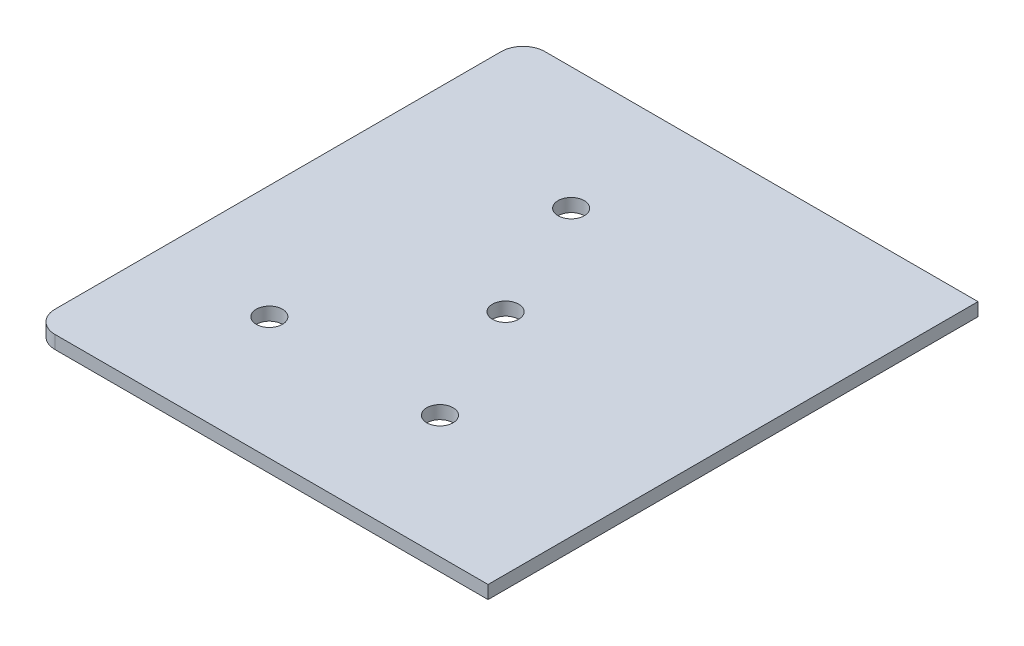
ISO-10303-21;
HEADER;
FILE_DESCRIPTION(('STEP AP214'),'2;1');
FILE_NAME('part.step','',(''),(''),'','','');
FILE_SCHEMA(('AUTOMOTIVE_DESIGN { 1 0 10303 214 1 1 1 1 }'));
ENDSEC;
DATA;
#1=APPLICATION_CONTEXT('core data for automotive mechanical design processes');
#2=APPLICATION_PROTOCOL_DEFINITION('international standard','automotive_design',2000,#1);
#3=PRODUCT_CONTEXT('',#1,'mechanical');
#4=PRODUCT('Part','Part','',(#3));
#5=PRODUCT_RELATED_PRODUCT_CATEGORY('part','',(#4));
#6=PRODUCT_DEFINITION_FORMATION('','',#4);
#7=PRODUCT_DEFINITION_CONTEXT('part definition',#1,'design');
#8=PRODUCT_DEFINITION('design','',#6,#7);
#9=PRODUCT_DEFINITION_SHAPE('','',#8);
#10=(LENGTH_UNIT() NAMED_UNIT(*) SI_UNIT(.MILLI.,.METRE.));
#11=(NAMED_UNIT(*) PLANE_ANGLE_UNIT() SI_UNIT($,.RADIAN.));
#12=(NAMED_UNIT(*) SI_UNIT($,.STERADIAN.) SOLID_ANGLE_UNIT());
#13=UNCERTAINTY_MEASURE_WITH_UNIT(LENGTH_MEASURE(1.E-05),#10,'distance_accuracy_value','');
#14=(GEOMETRIC_REPRESENTATION_CONTEXT(3) GLOBAL_UNCERTAINTY_ASSIGNED_CONTEXT((#13)) GLOBAL_UNIT_ASSIGNED_CONTEXT((#10,
#11,#12)) REPRESENTATION_CONTEXT('',''));
#15=CARTESIAN_POINT('',(0.,0.,0.));
#16=DIRECTION('',(0.,0.,1.));
#17=DIRECTION('',(1.,0.,0.));
#18=AXIS2_PLACEMENT_3D('',#15,#16,#17);
#19=CARTESIAN_POINT('',(228.6,9.525,0.));
#20=DIRECTION('',(1.,0.,0.));
#21=DIRECTION('',(0.,0.,-1.));
#22=AXIS2_PLACEMENT_3D('',#19,#20,#21);
#23=PLANE('',#22);
#24=DIRECTION('',(0.,0.,1.));
#25=VECTOR('',#24,1.);
#26=CARTESIAN_POINT('',(228.6,0.,0.));
#27=LINE('',#26,#25);
#28=CARTESIAN_POINT('',(228.6,0.,-161.925));
#29=VERTEX_POINT('',#28);
#30=CARTESIAN_POINT('',(228.6,0.,161.925));
#31=VERTEX_POINT('',#30);
#32=EDGE_CURVE('E115',#29,#31,#27,.T.);
#33=ORIENTED_EDGE('',*,*,#32,.T.);
#34=DIRECTION('',(0.,-1.,0.));
#35=VECTOR('',#34,1.);
#36=CARTESIAN_POINT('',(228.6,9.525,161.925));
#37=LINE('',#36,#35);
#38=CARTESIAN_POINT('',(228.6,9.525,161.925));
#39=VERTEX_POINT('',#38);
#40=EDGE_CURVE('E57',#31,#39,#37,.F.);
#41=ORIENTED_EDGE('',*,*,#40,.T.);
#42=DIRECTION('',(0.,0.,1.));
#43=VECTOR('',#42,1.);
#44=CARTESIAN_POINT('',(228.6,9.525,0.));
#45=LINE('',#44,#43);
#46=CARTESIAN_POINT('',(228.6,9.525,-161.925));
#47=VERTEX_POINT('',#46);
#48=EDGE_CURVE('E110',#47,#39,#45,.T.);
#49=ORIENTED_EDGE('',*,*,#48,.F.);
#50=DIRECTION('',(0.,-1.,0.));
#51=VECTOR('',#50,1.);
#52=CARTESIAN_POINT('',(228.6,0.,-161.925));
#53=LINE('',#52,#51);
#54=EDGE_CURVE('E133',#47,#29,#53,.T.);
#55=ORIENTED_EDGE('',*,*,#54,.T.);
#56=EDGE_LOOP('',(#33,#41,#49,#55));
#57=FACE_BOUND('',#56,.T.);
#58=ADVANCED_FACE('F36',(#57),#23,.F.);
#59=CARTESIAN_POINT('',(558.8,9.525,0.));
#60=DIRECTION('',(-1.,0.,0.));
#61=DIRECTION('',(0.,0.,1.));
#62=AXIS2_PLACEMENT_3D('',#59,#60,#61);
#63=PLANE('',#62);
#64=DIRECTION('',(0.,0.,-1.));
#65=VECTOR('',#64,1.);
#66=CARTESIAN_POINT('',(558.8,0.,0.));
#67=LINE('',#66,#65);
#68=CARTESIAN_POINT('',(558.8,0.,177.8));
#69=VERTEX_POINT('',#68);
#70=CARTESIAN_POINT('',(558.8,0.,-177.8));
#71=VERTEX_POINT('',#70);
#72=EDGE_CURVE('E117',#69,#71,#67,.T.);
#73=ORIENTED_EDGE('',*,*,#72,.T.);
#74=DIRECTION('',(0.,-1.,0.));
#75=VECTOR('',#74,1.);
#76=CARTESIAN_POINT('',(558.8,9.525,-177.8));
#77=LINE('',#76,#75);
#78=CARTESIAN_POINT('',(558.8,9.525,-177.8));
#79=VERTEX_POINT('',#78);
#80=EDGE_CURVE('E108',#79,#71,#77,.T.);
#81=ORIENTED_EDGE('',*,*,#80,.F.);
#82=DIRECTION('',(0.,0.,-1.));
#83=VECTOR('',#82,1.);
#84=CARTESIAN_POINT('',(558.8,9.525,0.));
#85=LINE('',#84,#83);
#86=CARTESIAN_POINT('',(558.8,9.525,177.8));
#87=VERTEX_POINT('',#86);
#88=EDGE_CURVE('E93',#87,#79,#85,.T.);
#89=ORIENTED_EDGE('',*,*,#88,.F.);
#90=DIRECTION('',(0.,-1.,0.));
#91=VECTOR('',#90,1.);
#92=CARTESIAN_POINT('',(558.8,9.525,177.8));
#93=LINE('',#92,#91);
#94=EDGE_CURVE('E100',#87,#69,#93,.T.);
#95=ORIENTED_EDGE('',*,*,#94,.T.);
#96=EDGE_LOOP('',(#73,#81,#89,#95));
#97=FACE_BOUND('',#96,.T.);
#98=ADVANCED_FACE('F106',(#97),#63,.F.);
#99=CARTESIAN_POINT('',(-912.372794199772,9.525,-177.8));
#100=DIRECTION('',(0.,0.,-1.));
#101=DIRECTION('',(-1.,0.,0.));
#102=AXIS2_PLACEMENT_3D('',#99,#100,#101);
#103=PLANE('',#102);
#104=DIRECTION('',(1.,0.,0.));
#105=VECTOR('',#104,1.);
#106=CARTESIAN_POINT('',(-912.372794199772,0.,-177.8));
#107=LINE('',#106,#105);
#108=CARTESIAN_POINT('',(244.475,0.,-177.8));
#109=VERTEX_POINT('',#108);
#110=EDGE_CURVE('E121',#109,#71,#107,.T.);
#111=ORIENTED_EDGE('',*,*,#110,.F.);
#112=DIRECTION('',(0.,-1.,0.));
#113=VECTOR('',#112,1.);
#114=CARTESIAN_POINT('',(244.475,9.525,-177.8));
#115=LINE('',#114,#113);
#116=CARTESIAN_POINT('',(244.475,9.525,-177.8));
#117=VERTEX_POINT('',#116);
#118=EDGE_CURVE('E11',#109,#117,#115,.F.);
#119=ORIENTED_EDGE('',*,*,#118,.T.);
#120=DIRECTION('',(1.,0.,0.));
#121=VECTOR('',#120,1.);
#122=CARTESIAN_POINT('',(-912.372794199772,9.525,-177.8));
#123=LINE('',#122,#121);
#124=EDGE_CURVE('E109',#117,#79,#123,.T.);
#125=ORIENTED_EDGE('',*,*,#124,.T.);
#126=ORIENTED_EDGE('',*,*,#80,.T.);
#127=EDGE_LOOP('',(#111,#119,#125,#126));
#128=FACE_BOUND('',#127,.T.);
#129=ADVANCED_FACE('F144',(#128),#103,.T.);
#130=CARTESIAN_POINT('',(-912.372794199772,9.525,0.));
#131=DIRECTION('',(0.,1.,0.));
#132=DIRECTION('',(0.,0.,1.));
#133=AXIS2_PLACEMENT_3D('',#130,#131,#132);
#134=PLANE('',#133);
#135=CARTESIAN_POINT('',(393.7,9.525,0.));
#136=DIRECTION('',(0.,-1.,0.));
#137=DIRECTION('',(0.,0.,-1.));
#138=AXIS2_PLACEMENT_3D('',#135,#136,#137);
#139=CIRCLE('',#138,9.52500000000002);
#140=CARTESIAN_POINT('',(393.7,9.525,-9.52499999999999));
#141=VERTEX_POINT('',#140);
#142=EDGE_CURVE('E164',#141,#141,#139,.T.);
#143=ORIENTED_EDGE('',*,*,#142,.T.);
#144=EDGE_LOOP('',(#143));
#145=FACE_BOUND('',#144,.T.);
#146=CARTESIAN_POINT('',(352.425,9.525,-88.9));
#147=DIRECTION('',(0.,-1.,0.));
#148=DIRECTION('',(0.,0.,-1.));
#149=AXIS2_PLACEMENT_3D('',#146,#147,#148);
#150=CIRCLE('',#149,9.52500000000002);
#151=CARTESIAN_POINT('',(352.425,9.525,-98.425));
#152=VERTEX_POINT('',#151);
#153=EDGE_CURVE('E158',#152,#152,#150,.T.);
#154=ORIENTED_EDGE('',*,*,#153,.T.);
#155=EDGE_LOOP('',(#154));
#156=FACE_BOUND('',#155,.T.);
#157=CARTESIAN_POINT('',(311.15,9.525,88.9));
#158=DIRECTION('',(0.,-1.,0.));
#159=DIRECTION('',(0.,0.,-1.));
#160=AXIS2_PLACEMENT_3D('',#157,#158,#159);
#161=CIRCLE('',#160,9.52500000000002);
#162=CARTESIAN_POINT('',(311.15,9.525,79.375));
#163=VERTEX_POINT('',#162);
#164=EDGE_CURVE('E152',#163,#163,#161,.T.);
#165=ORIENTED_EDGE('',*,*,#164,.T.);
#166=EDGE_LOOP('',(#165));
#167=FACE_BOUND('',#166,.T.);
#168=CARTESIAN_POINT('',(434.975,9.525,88.9000000000001));
#169=DIRECTION('',(0.,-1.,0.));
#170=DIRECTION('',(0.,0.,-1.));
#171=AXIS2_PLACEMENT_3D('',#168,#169,#170);
#172=CIRCLE('',#171,9.52500000000002);
#173=CARTESIAN_POINT('',(434.975,9.525,79.375));
#174=VERTEX_POINT('',#173);
#175=EDGE_CURVE('E145',#174,#174,#172,.T.);
#176=ORIENTED_EDGE('',*,*,#175,.T.);
#177=EDGE_LOOP('',(#176));
#178=FACE_BOUND('',#177,.T.);
#179=ORIENTED_EDGE('',*,*,#48,.T.);
#180=CARTESIAN_POINT('',(244.475,9.525,161.925));
#181=DIRECTION('',(0.,1.,0.));
#182=DIRECTION('',(0.,0.,1.));
#183=AXIS2_PLACEMENT_3D('',#180,#181,#182);
#184=CIRCLE('',#183,15.875);
#185=CARTESIAN_POINT('',(244.475,9.525,177.8));
#186=VERTEX_POINT('',#185);
#187=EDGE_CURVE('E44',#39,#186,#184,.T.);
#188=ORIENTED_EDGE('',*,*,#187,.T.);
#189=DIRECTION('',(1.,0.,0.));
#190=VECTOR('',#189,1.);
#191=CARTESIAN_POINT('',(-912.372794199772,9.525,177.8));
#192=LINE('',#191,#190);
#193=EDGE_CURVE('E90',#186,#87,#192,.T.);
#194=ORIENTED_EDGE('',*,*,#193,.T.);
#195=ORIENTED_EDGE('',*,*,#88,.T.);
#196=ORIENTED_EDGE('',*,*,#124,.F.);
#197=CARTESIAN_POINT('',(244.475,9.525,-161.925));
#198=DIRECTION('',(0.,1.,0.));
#199=DIRECTION('',(0.,0.,1.));
#200=AXIS2_PLACEMENT_3D('',#197,#198,#199);
#201=CIRCLE('',#200,15.875);
#202=EDGE_CURVE('E137',#117,#47,#201,.T.);
#203=ORIENTED_EDGE('',*,*,#202,.T.);
#204=EDGE_LOOP('',(#179,#188,#194,#195,#196,#203));
#205=FACE_BOUND('',#204,.T.);
#206=ADVANCED_FACE('F92',(#145,#156,#167,#178,#205),#134,.T.);
#207=CARTESIAN_POINT('',(-912.372794199772,0.,0.));
#208=DIRECTION('',(0.,1.,0.));
#209=DIRECTION('',(0.,0.,1.));
#210=AXIS2_PLACEMENT_3D('',#207,#208,#209);
#211=PLANE('',#210);
#212=CARTESIAN_POINT('',(393.7,0.,0.));
#213=DIRECTION('',(0.,-1.,0.));
#214=DIRECTION('',(0.,0.,-1.));
#215=AXIS2_PLACEMENT_3D('',#212,#213,#214);
#216=CIRCLE('',#215,9.52500000000002);
#217=CARTESIAN_POINT('',(393.7,0.,-9.52499999999999));
#218=VERTEX_POINT('',#217);
#219=EDGE_CURVE('E167',#218,#218,#216,.T.);
#220=ORIENTED_EDGE('',*,*,#219,.F.);
#221=EDGE_LOOP('',(#220));
#222=FACE_BOUND('',#221,.T.);
#223=CARTESIAN_POINT('',(352.425,0.,-88.9));
#224=DIRECTION('',(0.,-1.,0.));
#225=DIRECTION('',(0.,0.,-1.));
#226=AXIS2_PLACEMENT_3D('',#223,#224,#225);
#227=CIRCLE('',#226,9.52500000000002);
#228=CARTESIAN_POINT('',(352.425,0.,-98.425));
#229=VERTEX_POINT('',#228);
#230=EDGE_CURVE('E161',#229,#229,#227,.T.);
#231=ORIENTED_EDGE('',*,*,#230,.F.);
#232=EDGE_LOOP('',(#231));
#233=FACE_BOUND('',#232,.T.);
#234=CARTESIAN_POINT('',(311.15,0.,88.9));
#235=DIRECTION('',(0.,-1.,0.));
#236=DIRECTION('',(0.,0.,-1.));
#237=AXIS2_PLACEMENT_3D('',#234,#235,#236);
#238=CIRCLE('',#237,9.52500000000002);
#239=CARTESIAN_POINT('',(311.15,0.,79.375));
#240=VERTEX_POINT('',#239);
#241=EDGE_CURVE('E155',#240,#240,#238,.T.);
#242=ORIENTED_EDGE('',*,*,#241,.F.);
#243=EDGE_LOOP('',(#242));
#244=FACE_BOUND('',#243,.T.);
#245=CARTESIAN_POINT('',(434.975,0.,88.9000000000001));
#246=DIRECTION('',(0.,-1.,0.));
#247=DIRECTION('',(0.,0.,-1.));
#248=AXIS2_PLACEMENT_3D('',#245,#246,#247);
#249=CIRCLE('',#248,9.52500000000002);
#250=CARTESIAN_POINT('',(434.975,0.,79.375));
#251=VERTEX_POINT('',#250);
#252=EDGE_CURVE('E147',#251,#251,#249,.T.);
#253=ORIENTED_EDGE('',*,*,#252,.F.);
#254=EDGE_LOOP('',(#253));
#255=FACE_BOUND('',#254,.T.);
#256=DIRECTION('',(1.,0.,0.));
#257=VECTOR('',#256,1.);
#258=CARTESIAN_POINT('',(-912.372794199772,0.,177.8));
#259=LINE('',#258,#257);
#260=CARTESIAN_POINT('',(244.475,0.,177.8));
#261=VERTEX_POINT('',#260);
#262=EDGE_CURVE('E101',#261,#69,#259,.T.);
#263=ORIENTED_EDGE('',*,*,#262,.F.);
#264=CARTESIAN_POINT('',(244.475,0.,161.925));
#265=DIRECTION('',(0.,1.,0.));
#266=DIRECTION('',(0.,0.,1.));
#267=AXIS2_PLACEMENT_3D('',#264,#265,#266);
#268=CIRCLE('',#267,15.875);
#269=EDGE_CURVE('E131',#261,#31,#268,.F.);
#270=ORIENTED_EDGE('',*,*,#269,.T.);
#271=ORIENTED_EDGE('',*,*,#32,.F.);
#272=CARTESIAN_POINT('',(244.475,0.,-161.925));
#273=DIRECTION('',(0.,1.,0.));
#274=DIRECTION('',(0.,0.,1.));
#275=AXIS2_PLACEMENT_3D('',#272,#273,#274);
#276=CIRCLE('',#275,15.875);
#277=EDGE_CURVE('E129',#29,#109,#276,.F.);
#278=ORIENTED_EDGE('',*,*,#277,.T.);
#279=ORIENTED_EDGE('',*,*,#110,.T.);
#280=ORIENTED_EDGE('',*,*,#72,.F.);
#281=EDGE_LOOP('',(#263,#270,#271,#278,#279,#280));
#282=FACE_BOUND('',#281,.T.);
#283=ADVANCED_FACE('F143',(#222,#233,#244,#255,#282),#211,.F.);
#284=CARTESIAN_POINT('',(-912.372794199772,9.525,177.8));
#285=DIRECTION('',(0.,0.,-1.));
#286=DIRECTION('',(-1.,0.,0.));
#287=AXIS2_PLACEMENT_3D('',#284,#285,#286);
#288=PLANE('',#287);
#289=ORIENTED_EDGE('',*,*,#193,.F.);
#290=DIRECTION('',(0.,-1.,0.));
#291=VECTOR('',#290,1.);
#292=CARTESIAN_POINT('',(244.475,9.525,177.8));
#293=LINE('',#292,#291);
#294=EDGE_CURVE('E127',#186,#261,#293,.T.);
#295=ORIENTED_EDGE('',*,*,#294,.T.);
#296=ORIENTED_EDGE('',*,*,#262,.T.);
#297=ORIENTED_EDGE('',*,*,#94,.F.);
#298=EDGE_LOOP('',(#289,#295,#296,#297));
#299=FACE_BOUND('',#298,.T.);
#300=ADVANCED_FACE('F112',(#299),#288,.F.);
#301=CARTESIAN_POINT('',(434.975,9.525,88.9000000000001));
#302=DIRECTION('',(0.,-1.,0.));
#303=DIRECTION('',(0.,0.,-1.));
#304=AXIS2_PLACEMENT_3D('',#301,#302,#303);
#305=CYLINDRICAL_SURFACE('',#304,9.52500000000002);
#306=CARTESIAN_POINT('',(434.975,9.525,79.375));
#307=CARTESIAN_POINT('',(434.975,9.42578125,79.375));
#308=CARTESIAN_POINT('',(434.975,9.3265625,79.375));
#309=CARTESIAN_POINT('',(434.975,9.128125,79.375));
#310=CARTESIAN_POINT('',(434.975,9.02890625,79.375));
#311=CARTESIAN_POINT('',(434.975,8.83046875,79.375));
#312=CARTESIAN_POINT('',(434.975,8.73125,79.375));
#313=CARTESIAN_POINT('',(434.975,8.5328125,79.375));
#314=CARTESIAN_POINT('',(434.975,8.43359375,79.375));
#315=CARTESIAN_POINT('',(434.975,8.23515625,79.375));
#316=CARTESIAN_POINT('',(434.975,8.1359375,79.375));
#317=CARTESIAN_POINT('',(434.975,7.9375,79.375));
#318=CARTESIAN_POINT('',(434.975,7.83828125,79.375));
#319=CARTESIAN_POINT('',(434.975,7.63984375,79.375));
#320=CARTESIAN_POINT('',(434.975,7.540625,79.375));
#321=CARTESIAN_POINT('',(434.975,7.3421875,79.375));
#322=CARTESIAN_POINT('',(434.975,7.24296875,79.375));
#323=CARTESIAN_POINT('',(434.975,7.04453125,79.375));
#324=CARTESIAN_POINT('',(434.975,6.9453125,79.375));
#325=CARTESIAN_POINT('',(434.975,6.746875,79.375));
#326=CARTESIAN_POINT('',(434.975,6.64765625,79.375));
#327=CARTESIAN_POINT('',(434.975,6.44921875,79.375));
#328=CARTESIAN_POINT('',(434.975,6.35,79.375));
#329=CARTESIAN_POINT('',(434.975,6.1515625,79.375));
#330=CARTESIAN_POINT('',(434.975,6.05234375,79.375));
#331=CARTESIAN_POINT('',(434.975,5.85390625,79.375));
#332=CARTESIAN_POINT('',(434.975,5.7546875,79.375));
#333=CARTESIAN_POINT('',(434.975,5.55625,79.375));
#334=CARTESIAN_POINT('',(434.975,5.45703125,79.375));
#335=CARTESIAN_POINT('',(434.975,5.25859375,79.375));
#336=CARTESIAN_POINT('',(434.975,5.159375,79.375));
#337=CARTESIAN_POINT('',(434.975,4.9609375,79.375));
#338=CARTESIAN_POINT('',(434.975,4.86171875,79.375));
#339=CARTESIAN_POINT('',(434.975,4.66328125,79.375));
#340=CARTESIAN_POINT('',(434.975,4.5640625,79.375));
#341=CARTESIAN_POINT('',(434.975,4.365625,79.375));
#342=CARTESIAN_POINT('',(434.975,4.26640625,79.375));
#343=CARTESIAN_POINT('',(434.975,4.06796875,79.375));
#344=CARTESIAN_POINT('',(434.975,3.96875,79.375));
#345=CARTESIAN_POINT('',(434.975,3.7703125,79.375));
#346=CARTESIAN_POINT('',(434.975,3.67109375,79.375));
#347=CARTESIAN_POINT('',(434.975,3.47265625,79.375));
#348=CARTESIAN_POINT('',(434.975,3.3734375,79.375));
#349=CARTESIAN_POINT('',(434.975,3.175,79.375));
#350=CARTESIAN_POINT('',(434.975,3.07578125,79.375));
#351=CARTESIAN_POINT('',(434.975,2.87734375,79.375));
#352=CARTESIAN_POINT('',(434.975,2.778125,79.375));
#353=CARTESIAN_POINT('',(434.975,2.5796875,79.375));
#354=CARTESIAN_POINT('',(434.975,2.48046875,79.375));
#355=CARTESIAN_POINT('',(434.975,2.28203125,79.375));
#356=CARTESIAN_POINT('',(434.975,2.1828125,79.375));
#357=CARTESIAN_POINT('',(434.975,1.984375,79.375));
#358=CARTESIAN_POINT('',(434.975,1.88515625,79.375));
#359=CARTESIAN_POINT('',(434.975,1.68671875,79.375));
#360=CARTESIAN_POINT('',(434.975,1.5875,79.375));
#361=CARTESIAN_POINT('',(434.975,1.3890625,79.375));
#362=CARTESIAN_POINT('',(434.975,1.28984375,79.375));
#363=CARTESIAN_POINT('',(434.975,1.09140625,79.375));
#364=CARTESIAN_POINT('',(434.975,0.992187500000001,79.375));
#365=CARTESIAN_POINT('',(434.975,0.793750000000001,79.375));
#366=CARTESIAN_POINT('',(434.975,0.69453125,79.375));
#367=CARTESIAN_POINT('',(434.975,0.49609375,79.375));
#368=CARTESIAN_POINT('',(434.975,0.396875,79.375));
#369=CARTESIAN_POINT('',(434.975,0.1984375,79.375));
#370=CARTESIAN_POINT('',(434.975,0.0992187500000001,79.375));
#371=CARTESIAN_POINT('',(434.975,0.,79.375));
#372=B_SPLINE_CURVE_WITH_KNOTS('',3,(#306,#307,#308,#309,#310,#311,#312,#313,#314,#315,#316,
#317,#318,#319,#320,#321,#322,#323,#324,#325,#326,#327,#328,#329,#330,#331,#332,#333,#334,#335,
#336,#337,#338,#339,#340,#341,#342,#343,#344,#345,#346,#347,#348,#349,#350,#351,#352,#353,#354,
#355,#356,#357,#358,#359,#360,#361,#362,#363,#364,#365,#366,#367,#368,#369,#370,#371),
.UNSPECIFIED.,.F.,.F.,(4,2,2,2,2,2,2,2,2,2,2,2,2,2,2,2,2,2,2,2,2,2,2,2,2,2,2,2,2,2,2,2,4),(0.,
0.29765625,0.5953125,0.892968750000001,1.190625,1.48828125,1.7859375,2.08359375,2.38125,
2.67890625,2.9765625,3.27421875,3.571875,3.86953125,4.1671875,4.46484375,4.7625,5.06015625,
5.3578125,5.65546875,5.953125,6.25078125,6.5484375,6.84609375,7.14375,7.44140625,7.7390625,
8.03671875,8.334375,8.63203125,8.9296875,9.22734375,9.525),.UNSPECIFIED.);
#373=EDGE_CURVE('BSEAM192',#174,#251,#372,.T.);
#374=ORIENTED_EDGE('',*,*,#175,.F.);
#375=ORIENTED_EDGE('',*,*,#252,.T.);
#376=ORIENTED_EDGE('',*,*,#373,.T.);
#377=ORIENTED_EDGE('',*,*,#373,.F.);
#378=EDGE_LOOP('',(#374,#376,#375,#377));
#379=FACE_BOUND('',#378,.T.);
#380=ADVANCED_FACE('F192',(#379),#305,.F.);
#381=CARTESIAN_POINT('',(311.15,9.525,88.9));
#382=DIRECTION('',(0.,-1.,0.));
#383=DIRECTION('',(0.,0.,-1.));
#384=AXIS2_PLACEMENT_3D('',#381,#382,#383);
#385=CYLINDRICAL_SURFACE('',#384,9.52500000000002);
#386=CARTESIAN_POINT('',(311.15,9.525,79.375));
#387=CARTESIAN_POINT('',(311.15,9.42578125,79.375));
#388=CARTESIAN_POINT('',(311.15,9.3265625,79.375));
#389=CARTESIAN_POINT('',(311.15,9.128125,79.375));
#390=CARTESIAN_POINT('',(311.15,9.02890625,79.375));
#391=CARTESIAN_POINT('',(311.15,8.83046875,79.375));
#392=CARTESIAN_POINT('',(311.15,8.73125,79.375));
#393=CARTESIAN_POINT('',(311.15,8.5328125,79.375));
#394=CARTESIAN_POINT('',(311.15,8.43359375,79.375));
#395=CARTESIAN_POINT('',(311.15,8.23515625,79.375));
#396=CARTESIAN_POINT('',(311.15,8.1359375,79.375));
#397=CARTESIAN_POINT('',(311.15,7.9375,79.375));
#398=CARTESIAN_POINT('',(311.15,7.83828125,79.375));
#399=CARTESIAN_POINT('',(311.15,7.63984375,79.375));
#400=CARTESIAN_POINT('',(311.15,7.540625,79.375));
#401=CARTESIAN_POINT('',(311.15,7.3421875,79.375));
#402=CARTESIAN_POINT('',(311.15,7.24296875,79.375));
#403=CARTESIAN_POINT('',(311.15,7.04453125,79.375));
#404=CARTESIAN_POINT('',(311.15,6.9453125,79.375));
#405=CARTESIAN_POINT('',(311.15,6.746875,79.375));
#406=CARTESIAN_POINT('',(311.15,6.64765625,79.375));
#407=CARTESIAN_POINT('',(311.15,6.44921875,79.375));
#408=CARTESIAN_POINT('',(311.15,6.35,79.375));
#409=CARTESIAN_POINT('',(311.15,6.1515625,79.375));
#410=CARTESIAN_POINT('',(311.15,6.05234375,79.375));
#411=CARTESIAN_POINT('',(311.15,5.85390625,79.375));
#412=CARTESIAN_POINT('',(311.15,5.7546875,79.375));
#413=CARTESIAN_POINT('',(311.15,5.55625,79.375));
#414=CARTESIAN_POINT('',(311.15,5.45703125,79.375));
#415=CARTESIAN_POINT('',(311.15,5.25859375,79.375));
#416=CARTESIAN_POINT('',(311.15,5.159375,79.375));
#417=CARTESIAN_POINT('',(311.15,4.9609375,79.375));
#418=CARTESIAN_POINT('',(311.15,4.86171875,79.375));
#419=CARTESIAN_POINT('',(311.15,4.66328125,79.375));
#420=CARTESIAN_POINT('',(311.15,4.5640625,79.375));
#421=CARTESIAN_POINT('',(311.15,4.365625,79.375));
#422=CARTESIAN_POINT('',(311.15,4.26640625,79.375));
#423=CARTESIAN_POINT('',(311.15,4.06796875,79.375));
#424=CARTESIAN_POINT('',(311.15,3.96875,79.375));
#425=CARTESIAN_POINT('',(311.15,3.7703125,79.375));
#426=CARTESIAN_POINT('',(311.15,3.67109375,79.375));
#427=CARTESIAN_POINT('',(311.15,3.47265625,79.375));
#428=CARTESIAN_POINT('',(311.15,3.3734375,79.375));
#429=CARTESIAN_POINT('',(311.15,3.175,79.375));
#430=CARTESIAN_POINT('',(311.15,3.07578125,79.375));
#431=CARTESIAN_POINT('',(311.15,2.87734375,79.375));
#432=CARTESIAN_POINT('',(311.15,2.778125,79.375));
#433=CARTESIAN_POINT('',(311.15,2.5796875,79.375));
#434=CARTESIAN_POINT('',(311.15,2.48046875,79.375));
#435=CARTESIAN_POINT('',(311.15,2.28203125,79.375));
#436=CARTESIAN_POINT('',(311.15,2.1828125,79.375));
#437=CARTESIAN_POINT('',(311.15,1.984375,79.375));
#438=CARTESIAN_POINT('',(311.15,1.88515625,79.375));
#439=CARTESIAN_POINT('',(311.15,1.68671875,79.375));
#440=CARTESIAN_POINT('',(311.15,1.5875,79.375));
#441=CARTESIAN_POINT('',(311.15,1.3890625,79.375));
#442=CARTESIAN_POINT('',(311.15,1.28984375,79.375));
#443=CARTESIAN_POINT('',(311.15,1.09140625,79.375));
#444=CARTESIAN_POINT('',(311.15,0.992187500000001,79.375));
#445=CARTESIAN_POINT('',(311.15,0.793750000000001,79.375));
#446=CARTESIAN_POINT('',(311.15,0.69453125,79.375));
#447=CARTESIAN_POINT('',(311.15,0.49609375,79.375));
#448=CARTESIAN_POINT('',(311.15,0.396875,79.375));
#449=CARTESIAN_POINT('',(311.15,0.1984375,79.375));
#450=CARTESIAN_POINT('',(311.15,0.0992187500000001,79.375));
#451=CARTESIAN_POINT('',(311.15,0.,79.375));
#452=B_SPLINE_CURVE_WITH_KNOTS('',3,(#386,#387,#388,#389,#390,#391,#392,#393,#394,#395,#396,
#397,#398,#399,#400,#401,#402,#403,#404,#405,#406,#407,#408,#409,#410,#411,#412,#413,#414,#415,
#416,#417,#418,#419,#420,#421,#422,#423,#424,#425,#426,#427,#428,#429,#430,#431,#432,#433,#434,
#435,#436,#437,#438,#439,#440,#441,#442,#443,#444,#445,#446,#447,#448,#449,#450,#451),
.UNSPECIFIED.,.F.,.F.,(4,2,2,2,2,2,2,2,2,2,2,2,2,2,2,2,2,2,2,2,2,2,2,2,2,2,2,2,2,2,2,2,4),(0.,
0.29765625,0.5953125,0.892968750000001,1.190625,1.48828125,1.7859375,2.08359375,2.38125,
2.67890625,2.9765625,3.27421875,3.571875,3.86953125,4.1671875,4.46484375,4.7625,5.06015625,
5.3578125,5.65546875,5.953125,6.25078125,6.5484375,6.84609375,7.14375,7.44140625,7.7390625,
8.03671875,8.334375,8.63203125,8.9296875,9.22734375,9.525),.UNSPECIFIED.);
#453=EDGE_CURVE('BSEAM194',#163,#240,#452,.T.);
#454=ORIENTED_EDGE('',*,*,#164,.F.);
#455=ORIENTED_EDGE('',*,*,#241,.T.);
#456=ORIENTED_EDGE('',*,*,#453,.T.);
#457=ORIENTED_EDGE('',*,*,#453,.F.);
#458=EDGE_LOOP('',(#454,#456,#455,#457));
#459=FACE_BOUND('',#458,.T.);
#460=ADVANCED_FACE('F194',(#459),#385,.F.);
#461=CARTESIAN_POINT('',(352.425,9.525,-88.9));
#462=DIRECTION('',(0.,-1.,0.));
#463=DIRECTION('',(0.,0.,-1.));
#464=AXIS2_PLACEMENT_3D('',#461,#462,#463);
#465=CYLINDRICAL_SURFACE('',#464,9.52500000000002);
#466=CARTESIAN_POINT('',(352.425,9.525,-98.425));
#467=CARTESIAN_POINT('',(352.425,9.42578125,-98.425));
#468=CARTESIAN_POINT('',(352.425,9.3265625,-98.425));
#469=CARTESIAN_POINT('',(352.425,9.128125,-98.425));
#470=CARTESIAN_POINT('',(352.425,9.02890625,-98.425));
#471=CARTESIAN_POINT('',(352.425,8.83046875,-98.425));
#472=CARTESIAN_POINT('',(352.425,8.73125,-98.425));
#473=CARTESIAN_POINT('',(352.425,8.5328125,-98.425));
#474=CARTESIAN_POINT('',(352.425,8.43359375,-98.425));
#475=CARTESIAN_POINT('',(352.425,8.23515625,-98.425));
#476=CARTESIAN_POINT('',(352.425,8.1359375,-98.425));
#477=CARTESIAN_POINT('',(352.425,7.9375,-98.425));
#478=CARTESIAN_POINT('',(352.425,7.83828125,-98.425));
#479=CARTESIAN_POINT('',(352.425,7.63984375,-98.425));
#480=CARTESIAN_POINT('',(352.425,7.540625,-98.425));
#481=CARTESIAN_POINT('',(352.425,7.3421875,-98.425));
#482=CARTESIAN_POINT('',(352.425,7.24296875,-98.425));
#483=CARTESIAN_POINT('',(352.425,7.04453125,-98.425));
#484=CARTESIAN_POINT('',(352.425,6.9453125,-98.425));
#485=CARTESIAN_POINT('',(352.425,6.746875,-98.425));
#486=CARTESIAN_POINT('',(352.425,6.64765625,-98.425));
#487=CARTESIAN_POINT('',(352.425,6.44921875,-98.425));
#488=CARTESIAN_POINT('',(352.425,6.35,-98.425));
#489=CARTESIAN_POINT('',(352.425,6.1515625,-98.425));
#490=CARTESIAN_POINT('',(352.425,6.05234375,-98.425));
#491=CARTESIAN_POINT('',(352.425,5.85390625,-98.425));
#492=CARTESIAN_POINT('',(352.425,5.7546875,-98.425));
#493=CARTESIAN_POINT('',(352.425,5.55625,-98.425));
#494=CARTESIAN_POINT('',(352.425,5.45703125,-98.425));
#495=CARTESIAN_POINT('',(352.425,5.25859375,-98.425));
#496=CARTESIAN_POINT('',(352.425,5.159375,-98.425));
#497=CARTESIAN_POINT('',(352.425,4.9609375,-98.425));
#498=CARTESIAN_POINT('',(352.425,4.86171875,-98.425));
#499=CARTESIAN_POINT('',(352.425,4.66328125,-98.425));
#500=CARTESIAN_POINT('',(352.425,4.5640625,-98.425));
#501=CARTESIAN_POINT('',(352.425,4.365625,-98.425));
#502=CARTESIAN_POINT('',(352.425,4.26640625,-98.425));
#503=CARTESIAN_POINT('',(352.425,4.06796875,-98.425));
#504=CARTESIAN_POINT('',(352.425,3.96875,-98.425));
#505=CARTESIAN_POINT('',(352.425,3.7703125,-98.425));
#506=CARTESIAN_POINT('',(352.425,3.67109375,-98.425));
#507=CARTESIAN_POINT('',(352.425,3.47265625,-98.425));
#508=CARTESIAN_POINT('',(352.425,3.3734375,-98.425));
#509=CARTESIAN_POINT('',(352.425,3.175,-98.425));
#510=CARTESIAN_POINT('',(352.425,3.07578125,-98.425));
#511=CARTESIAN_POINT('',(352.425,2.87734375,-98.425));
#512=CARTESIAN_POINT('',(352.425,2.778125,-98.425));
#513=CARTESIAN_POINT('',(352.425,2.5796875,-98.425));
#514=CARTESIAN_POINT('',(352.425,2.48046875,-98.425));
#515=CARTESIAN_POINT('',(352.425,2.28203125,-98.425));
#516=CARTESIAN_POINT('',(352.425,2.1828125,-98.425));
#517=CARTESIAN_POINT('',(352.425,1.984375,-98.425));
#518=CARTESIAN_POINT('',(352.425,1.88515625,-98.425));
#519=CARTESIAN_POINT('',(352.425,1.68671875,-98.425));
#520=CARTESIAN_POINT('',(352.425,1.5875,-98.425));
#521=CARTESIAN_POINT('',(352.425,1.3890625,-98.425));
#522=CARTESIAN_POINT('',(352.425,1.28984375,-98.425));
#523=CARTESIAN_POINT('',(352.425,1.09140625,-98.425));
#524=CARTESIAN_POINT('',(352.425,0.992187500000001,-98.425));
#525=CARTESIAN_POINT('',(352.425,0.793750000000001,-98.425));
#526=CARTESIAN_POINT('',(352.425,0.69453125,-98.425));
#527=CARTESIAN_POINT('',(352.425,0.49609375,-98.425));
#528=CARTESIAN_POINT('',(352.425,0.396875,-98.425));
#529=CARTESIAN_POINT('',(352.425,0.1984375,-98.425));
#530=CARTESIAN_POINT('',(352.425,0.0992187500000001,-98.425));
#531=CARTESIAN_POINT('',(352.425,0.,-98.425));
#532=B_SPLINE_CURVE_WITH_KNOTS('',3,(#466,#467,#468,#469,#470,#471,#472,#473,#474,#475,#476,
#477,#478,#479,#480,#481,#482,#483,#484,#485,#486,#487,#488,#489,#490,#491,#492,#493,#494,#495,
#496,#497,#498,#499,#500,#501,#502,#503,#504,#505,#506,#507,#508,#509,#510,#511,#512,#513,#514,
#515,#516,#517,#518,#519,#520,#521,#522,#523,#524,#525,#526,#527,#528,#529,#530,#531),
.UNSPECIFIED.,.F.,.F.,(4,2,2,2,2,2,2,2,2,2,2,2,2,2,2,2,2,2,2,2,2,2,2,2,2,2,2,2,2,2,2,2,4),(0.,
0.29765625,0.5953125,0.892968750000001,1.190625,1.48828125,1.7859375,2.08359375,2.38125,
2.67890625,2.9765625,3.27421875,3.571875,3.86953125,4.1671875,4.46484375,4.7625,5.06015625,
5.3578125,5.65546875,5.953125,6.25078125,6.5484375,6.84609375,7.14375,7.44140625,7.7390625,
8.03671875,8.334375,8.63203125,8.9296875,9.22734375,9.525),.UNSPECIFIED.);
#533=EDGE_CURVE('BSEAM179',#152,#229,#532,.T.);
#534=ORIENTED_EDGE('',*,*,#153,.F.);
#535=ORIENTED_EDGE('',*,*,#230,.T.);
#536=ORIENTED_EDGE('',*,*,#533,.T.);
#537=ORIENTED_EDGE('',*,*,#533,.F.);
#538=EDGE_LOOP('',(#534,#536,#535,#537));
#539=FACE_BOUND('',#538,.T.);
#540=ADVANCED_FACE('F179',(#539),#465,.F.);
#541=CARTESIAN_POINT('',(393.7,9.525,0.));
#542=DIRECTION('',(0.,-1.,0.));
#543=DIRECTION('',(0.,0.,-1.));
#544=AXIS2_PLACEMENT_3D('',#541,#542,#543);
#545=CYLINDRICAL_SURFACE('',#544,9.52500000000002);
#546=CARTESIAN_POINT('',(393.7,9.525,-9.52499999999999));
#547=CARTESIAN_POINT('',(393.7,9.42578125,-9.52499999999999));
#548=CARTESIAN_POINT('',(393.7,9.3265625,-9.52499999999999));
#549=CARTESIAN_POINT('',(393.7,9.128125,-9.52499999999999));
#550=CARTESIAN_POINT('',(393.7,9.02890625,-9.52499999999999));
#551=CARTESIAN_POINT('',(393.7,8.83046875,-9.52499999999999));
#552=CARTESIAN_POINT('',(393.7,8.73125,-9.52499999999999));
#553=CARTESIAN_POINT('',(393.7,8.5328125,-9.52499999999999));
#554=CARTESIAN_POINT('',(393.7,8.43359375,-9.52499999999999));
#555=CARTESIAN_POINT('',(393.7,8.23515625,-9.52499999999999));
#556=CARTESIAN_POINT('',(393.7,8.1359375,-9.52499999999999));
#557=CARTESIAN_POINT('',(393.7,7.9375,-9.52499999999999));
#558=CARTESIAN_POINT('',(393.7,7.83828125,-9.52499999999999));
#559=CARTESIAN_POINT('',(393.7,7.63984375,-9.52499999999999));
#560=CARTESIAN_POINT('',(393.7,7.540625,-9.52499999999999));
#561=CARTESIAN_POINT('',(393.7,7.3421875,-9.52499999999999));
#562=CARTESIAN_POINT('',(393.7,7.24296875,-9.52499999999999));
#563=CARTESIAN_POINT('',(393.7,7.04453125,-9.52499999999999));
#564=CARTESIAN_POINT('',(393.7,6.9453125,-9.52499999999999));
#565=CARTESIAN_POINT('',(393.7,6.746875,-9.52499999999999));
#566=CARTESIAN_POINT('',(393.7,6.64765625,-9.52499999999999));
#567=CARTESIAN_POINT('',(393.7,6.44921875,-9.52499999999999));
#568=CARTESIAN_POINT('',(393.7,6.35,-9.52499999999999));
#569=CARTESIAN_POINT('',(393.7,6.1515625,-9.52499999999999));
#570=CARTESIAN_POINT('',(393.7,6.05234375,-9.52499999999999));
#571=CARTESIAN_POINT('',(393.7,5.85390625,-9.52499999999999));
#572=CARTESIAN_POINT('',(393.7,5.7546875,-9.52499999999999));
#573=CARTESIAN_POINT('',(393.7,5.55625,-9.52499999999999));
#574=CARTESIAN_POINT('',(393.7,5.45703125,-9.52499999999999));
#575=CARTESIAN_POINT('',(393.7,5.25859375,-9.52499999999999));
#576=CARTESIAN_POINT('',(393.7,5.159375,-9.52499999999999));
#577=CARTESIAN_POINT('',(393.7,4.9609375,-9.52499999999999));
#578=CARTESIAN_POINT('',(393.7,4.86171875,-9.52499999999999));
#579=CARTESIAN_POINT('',(393.7,4.66328125,-9.52499999999999));
#580=CARTESIAN_POINT('',(393.7,4.5640625,-9.52499999999999));
#581=CARTESIAN_POINT('',(393.7,4.365625,-9.52499999999999));
#582=CARTESIAN_POINT('',(393.7,4.26640625,-9.52499999999999));
#583=CARTESIAN_POINT('',(393.7,4.06796875,-9.52499999999999));
#584=CARTESIAN_POINT('',(393.7,3.96875,-9.52499999999999));
#585=CARTESIAN_POINT('',(393.7,3.7703125,-9.52499999999999));
#586=CARTESIAN_POINT('',(393.7,3.67109375,-9.52499999999999));
#587=CARTESIAN_POINT('',(393.7,3.47265625,-9.52499999999999));
#588=CARTESIAN_POINT('',(393.7,3.3734375,-9.52499999999999));
#589=CARTESIAN_POINT('',(393.7,3.175,-9.52499999999999));
#590=CARTESIAN_POINT('',(393.7,3.07578125,-9.52499999999999));
#591=CARTESIAN_POINT('',(393.7,2.87734375,-9.52499999999999));
#592=CARTESIAN_POINT('',(393.7,2.778125,-9.52499999999999));
#593=CARTESIAN_POINT('',(393.7,2.5796875,-9.52499999999999));
#594=CARTESIAN_POINT('',(393.7,2.48046875,-9.52499999999999));
#595=CARTESIAN_POINT('',(393.7,2.28203125,-9.52499999999999));
#596=CARTESIAN_POINT('',(393.7,2.1828125,-9.52499999999999));
#597=CARTESIAN_POINT('',(393.7,1.984375,-9.52499999999999));
#598=CARTESIAN_POINT('',(393.7,1.88515625,-9.52499999999999));
#599=CARTESIAN_POINT('',(393.7,1.68671875,-9.52499999999999));
#600=CARTESIAN_POINT('',(393.7,1.5875,-9.52499999999999));
#601=CARTESIAN_POINT('',(393.7,1.3890625,-9.52499999999999));
#602=CARTESIAN_POINT('',(393.7,1.28984375,-9.52499999999999));
#603=CARTESIAN_POINT('',(393.7,1.09140625,-9.52499999999999));
#604=CARTESIAN_POINT('',(393.7,0.992187500000001,-9.52499999999999));
#605=CARTESIAN_POINT('',(393.7,0.793750000000001,-9.52499999999999));
#606=CARTESIAN_POINT('',(393.7,0.69453125,-9.52499999999999));
#607=CARTESIAN_POINT('',(393.7,0.49609375,-9.52499999999999));
#608=CARTESIAN_POINT('',(393.7,0.396875,-9.52499999999999));
#609=CARTESIAN_POINT('',(393.7,0.1984375,-9.52499999999999));
#610=CARTESIAN_POINT('',(393.7,0.0992187500000001,-9.52499999999999));
#611=CARTESIAN_POINT('',(393.7,0.,-9.52499999999999));
#612=B_SPLINE_CURVE_WITH_KNOTS('',3,(#546,#547,#548,#549,#550,#551,#552,#553,#554,#555,#556,
#557,#558,#559,#560,#561,#562,#563,#564,#565,#566,#567,#568,#569,#570,#571,#572,#573,#574,#575,
#576,#577,#578,#579,#580,#581,#582,#583,#584,#585,#586,#587,#588,#589,#590,#591,#592,#593,#594,
#595,#596,#597,#598,#599,#600,#601,#602,#603,#604,#605,#606,#607,#608,#609,#610,#611),
.UNSPECIFIED.,.F.,.F.,(4,2,2,2,2,2,2,2,2,2,2,2,2,2,2,2,2,2,2,2,2,2,2,2,2,2,2,2,2,2,2,2,4),(0.,
0.29765625,0.5953125,0.892968750000001,1.190625,1.48828125,1.7859375,2.08359375,2.38125,
2.67890625,2.9765625,3.27421875,3.571875,3.86953125,4.1671875,4.46484375,4.7625,5.06015625,
5.3578125,5.65546875,5.953125,6.25078125,6.5484375,6.84609375,7.14375,7.44140625,7.7390625,
8.03671875,8.334375,8.63203125,8.9296875,9.22734375,9.525),.UNSPECIFIED.);
#613=EDGE_CURVE('BSEAM175',#141,#218,#612,.T.);
#614=ORIENTED_EDGE('',*,*,#142,.F.);
#615=ORIENTED_EDGE('',*,*,#219,.T.);
#616=ORIENTED_EDGE('',*,*,#613,.T.);
#617=ORIENTED_EDGE('',*,*,#613,.F.);
#618=EDGE_LOOP('',(#614,#616,#615,#617));
#619=FACE_BOUND('',#618,.T.);
#620=ADVANCED_FACE('F175',(#619),#545,.F.);
#621=CARTESIAN_POINT('',(244.475,9.525,161.925));
#622=DIRECTION('',(0.,-1.,0.));
#623=DIRECTION('',(0.,0.,-1.));
#624=AXIS2_PLACEMENT_3D('',#621,#622,#623);
#625=CYLINDRICAL_SURFACE('',#624,15.875);
#626=ORIENTED_EDGE('',*,*,#187,.F.);
#627=ORIENTED_EDGE('',*,*,#40,.F.);
#628=ORIENTED_EDGE('',*,*,#269,.F.);
#629=ORIENTED_EDGE('',*,*,#294,.F.);
#630=EDGE_LOOP('',(#626,#627,#628,#629));
#631=FACE_BOUND('',#630,.T.);
#632=ADVANCED_FACE('F178',(#631),#625,.T.);
#633=CARTESIAN_POINT('',(244.475,9.525,-161.925));
#634=DIRECTION('',(0.,1.,0.));
#635=DIRECTION('',(0.,0.,1.));
#636=AXIS2_PLACEMENT_3D('',#633,#634,#635);
#637=CYLINDRICAL_SURFACE('',#636,15.875);
#638=ORIENTED_EDGE('',*,*,#202,.F.);
#639=ORIENTED_EDGE('',*,*,#118,.F.);
#640=ORIENTED_EDGE('',*,*,#277,.F.);
#641=ORIENTED_EDGE('',*,*,#54,.F.);
#642=EDGE_LOOP('',(#638,#639,#640,#641));
#643=FACE_BOUND('',#642,.T.);
#644=ADVANCED_FACE('F38',(#643),#637,.T.);
#645=CLOSED_SHELL('',(#58,#98,#129,#206,#283,#300,#380,#460,#540,#620,#632,#644));
#646=MANIFOLD_SOLID_BREP('B2',#645);
#647=ADVANCED_BREP_SHAPE_REPRESENTATION('',(#18,#646),#14);
#648=SHAPE_DEFINITION_REPRESENTATION(#9,#647);
ENDSEC;
END-ISO-10303-21;
